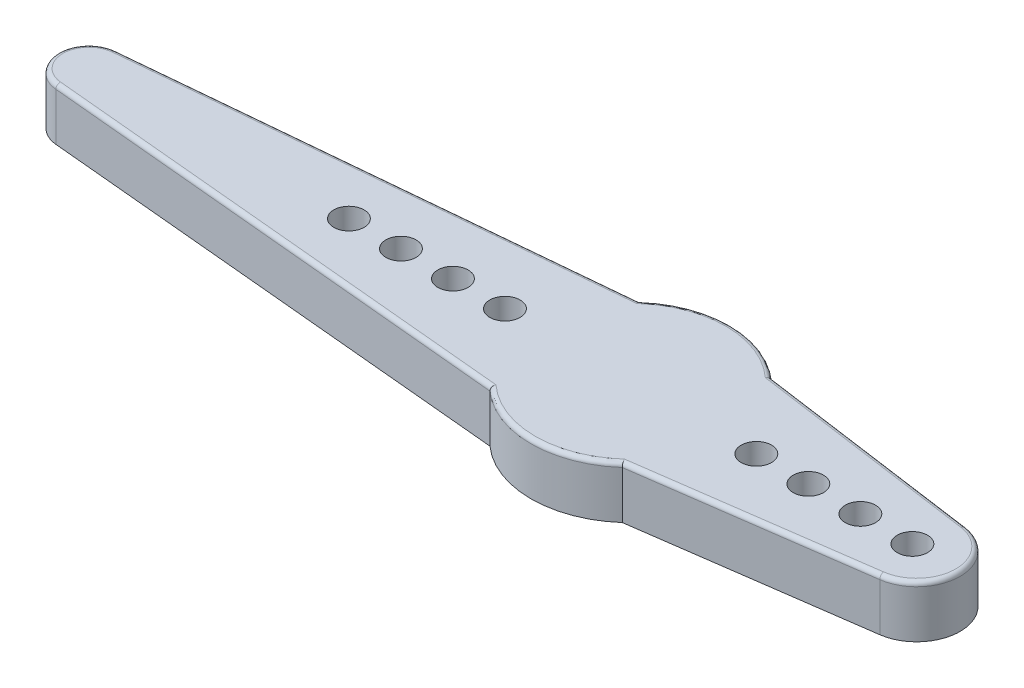
ISO-10303-21;
HEADER;
FILE_DESCRIPTION(('STEP AP214'),'2;1');
FILE_NAME('part.step','',(''),(''),'','','');
FILE_SCHEMA(('AUTOMOTIVE_DESIGN { 1 0 10303 214 1 1 1 1 }'));
ENDSEC;
DATA;
#1=APPLICATION_CONTEXT('core data for automotive mechanical design processes');
#2=APPLICATION_PROTOCOL_DEFINITION('international standard','automotive_design',2000,#1);
#3=PRODUCT_CONTEXT('',#1,'mechanical');
#4=PRODUCT('Part','Part','',(#3));
#5=PRODUCT_RELATED_PRODUCT_CATEGORY('part','',(#4));
#6=PRODUCT_DEFINITION_FORMATION('','',#4);
#7=PRODUCT_DEFINITION_CONTEXT('part definition',#1,'design');
#8=PRODUCT_DEFINITION('design','',#6,#7);
#9=PRODUCT_DEFINITION_SHAPE('','',#8);
#10=(LENGTH_UNIT() NAMED_UNIT(*) SI_UNIT(.MILLI.,.METRE.));
#11=(NAMED_UNIT(*) PLANE_ANGLE_UNIT() SI_UNIT($,.RADIAN.));
#12=(NAMED_UNIT(*) SI_UNIT($,.STERADIAN.) SOLID_ANGLE_UNIT());
#13=UNCERTAINTY_MEASURE_WITH_UNIT(LENGTH_MEASURE(1.E-05),#10,'distance_accuracy_value','');
#14=(GEOMETRIC_REPRESENTATION_CONTEXT(3) GLOBAL_UNCERTAINTY_ASSIGNED_CONTEXT((#13)) GLOBAL_UNIT_ASSIGNED_CONTEXT((#10,
#11,#12)) REPRESENTATION_CONTEXT('',''));
#15=CARTESIAN_POINT('',(0.,0.,0.));
#16=DIRECTION('',(0.,0.,1.));
#17=DIRECTION('',(1.,0.,0.));
#18=AXIS2_PLACEMENT_3D('',#15,#16,#17);
#19=CARTESIAN_POINT('',(43.4839094416453,11.7785052175783,39.0093832828117));
#20=DIRECTION('',(0.,-1.,0.));
#21=DIRECTION('',(0.,0.,-1.));
#22=AXIS2_PLACEMENT_3D('',#19,#20,#21);
#23=CYLINDRICAL_SURFACE('',#22,3.5);
#24=CARTESIAN_POINT('',(43.4839094416453,8.77850521757827,39.0093832828117));
#25=DIRECTION('',(0.,1.,0.));
#26=DIRECTION('',(0.,0.,1.));
#27=AXIS2_PLACEMENT_3D('',#24,#25,#26);
#28=CIRCLE('',#27,3.5);
#29=CARTESIAN_POINT('',(43.4839094416453,8.77850521757827,42.5093832828117));
#30=VERTEX_POINT('',#29);
#31=EDGE_CURVE('E234',#30,#30,#28,.T.);
#32=ORIENTED_EDGE('',*,*,#31,.F.);
#33=EDGE_LOOP('',(#32));
#34=FACE_BOUND('',#33,.T.);
#35=CARTESIAN_POINT('',(43.4839094416453,9.77850521757827,39.0093832828117));
#36=DIRECTION('',(0.,1.,0.));
#37=DIRECTION('',(0.,0.,1.));
#38=AXIS2_PLACEMENT_3D('',#35,#36,#37);
#39=CIRCLE('',#38,3.5);
#40=CARTESIAN_POINT('',(43.4839094416453,9.77850521757827,42.5093832828117));
#41=VERTEX_POINT('',#40);
#42=EDGE_CURVE('E172',#41,#41,#39,.F.);
#43=ORIENTED_EDGE('',*,*,#42,.F.);
#44=EDGE_LOOP('',(#43));
#45=FACE_BOUND('',#44,.T.);
#46=ADVANCED_FACE('F49',(#34,#45),#23,.F.);
#47=CARTESIAN_POINT('',(-3.6419710304706,11.7785052175783,39.2954801281411));
#48=DIRECTION('',(0.0922861612578902,0.,-0.995732526555341));
#49=DIRECTION('',(-0.995732526555341,0.,-0.0922861612578902));
#50=AXIS2_PLACEMENT_3D('',#47,#48,#49);
#51=PLANE('',#50);
#52=DIRECTION('',(0.,-1.,0.));
#53=VECTOR('',#52,1.);
#54=CARTESIAN_POINT('',(39.6665150423201,11.7785052175783,43.3093832828117));
#55=LINE('',#54,#53);
#56=CARTESIAN_POINT('',(39.6665150423201,11.5285052175783,43.3093832828117));
#57=VERTEX_POINT('',#56);
#58=CARTESIAN_POINT('',(39.6665150423201,8.77850521757827,43.3093832828117));
#59=VERTEX_POINT('',#58);
#60=EDGE_CURVE('E144',#57,#59,#55,.T.);
#61=ORIENTED_EDGE('',*,*,#60,.F.);
#62=DIRECTION('',(0.995732526555341,0.,0.0922861612578902));
#63=VECTOR('',#62,1.);
#64=CARTESIAN_POINT('',(12.072408659444,11.5285052175783,40.7519152042835));
#65=LINE('',#64,#63);
#66=CARTESIAN_POINT('',(12.072408659444,11.5285052175783,40.7519152042835));
#67=VERTEX_POINT('',#66);
#68=EDGE_CURVE('E12',#57,#67,#65,.F.);
#69=ORIENTED_EDGE('',*,*,#68,.T.);
#70=DIRECTION('',(0.,-1.,0.));
#71=VECTOR('',#70,1.);
#72=CARTESIAN_POINT('',(12.072408659444,11.7785052175783,40.7519152042835));
#73=LINE('',#72,#71);
#74=CARTESIAN_POINT('',(12.072408659444,8.77850521757827,40.7519152042835));
#75=VERTEX_POINT('',#74);
#76=EDGE_CURVE('E170',#67,#75,#73,.T.);
#77=ORIENTED_EDGE('',*,*,#76,.T.);
#78=DIRECTION('',(0.995732526555341,0.,0.0922861612578902));
#79=VECTOR('',#78,1.);
#80=CARTESIAN_POINT('',(-3.6419710304706,8.77850521757827,39.2954801281411));
#81=LINE('',#80,#79);
#82=EDGE_CURVE('E161',#75,#59,#81,.T.);
#83=ORIENTED_EDGE('',*,*,#82,.T.);
#84=EDGE_LOOP('',(#61,#69,#77,#83));
#85=FACE_BOUND('',#84,.T.);
#86=ADVANCED_FACE('F168',(#85),#51,.F.);
#87=CARTESIAN_POINT('',(43.4839094416453,11.7785052175783,39.0093832828117));
#88=DIRECTION('',(0.,-1.,0.));
#89=DIRECTION('',(0.,0.,-1.));
#90=AXIS2_PLACEMENT_3D('',#87,#88,#89);
#91=CYLINDRICAL_SURFACE('',#90,5.75);
#92=DIRECTION('',(0.,-1.,0.));
#93=VECTOR('',#92,1.);
#94=CARTESIAN_POINT('',(47.3013038409706,11.7785052175783,43.3093832828117));
#95=LINE('',#94,#93);
#96=CARTESIAN_POINT('',(47.3013038409706,11.5285052175783,43.3093832828117));
#97=VERTEX_POINT('',#96);
#98=CARTESIAN_POINT('',(47.3013038409706,8.77850521757827,43.3093832828117));
#99=VERTEX_POINT('',#98);
#100=EDGE_CURVE('E154',#97,#99,#95,.T.);
#101=ORIENTED_EDGE('',*,*,#100,.F.);
#102=CARTESIAN_POINT('',(43.4839094416453,11.5285052175783,39.0093832828117));
#103=DIRECTION('',(0.,1.,0.));
#104=DIRECTION('',(0.,0.,1.));
#105=AXIS2_PLACEMENT_3D('',#102,#103,#104);
#106=CIRCLE('',#105,5.75);
#107=EDGE_CURVE('E65',#97,#57,#106,.F.);
#108=ORIENTED_EDGE('',*,*,#107,.T.);
#109=ORIENTED_EDGE('',*,*,#60,.T.);
#110=CARTESIAN_POINT('',(43.4839094416453,8.77850521757827,39.0093832828117));
#111=DIRECTION('',(0.,1.,0.));
#112=DIRECTION('',(0.,0.,1.));
#113=AXIS2_PLACEMENT_3D('',#110,#111,#112);
#114=CIRCLE('',#113,5.75);
#115=EDGE_CURVE('E147',#59,#99,#114,.T.);
#116=ORIENTED_EDGE('',*,*,#115,.T.);
#117=EDGE_LOOP('',(#101,#108,#109,#116));
#118=FACE_BOUND('',#117,.T.);
#119=ADVANCED_FACE('F146',(#118),#91,.T.);
#120=CARTESIAN_POINT('',(6.85626332111162,11.7785052175783,48.9718569028592));
#121=DIRECTION('',(-0.138651877853248,0.,-0.990341182001318));
#122=DIRECTION('',(-0.990341182001318,0.,0.138651877853248));
#123=AXIS2_PLACEMENT_3D('',#120,#121,#122);
#124=PLANE('',#123);
#125=DIRECTION('',(0.,-1.,0.));
#126=VECTOR('',#125,1.);
#127=CARTESIAN_POINT('',(60.3305391362785,11.7785052175783,41.485236237815));
#128=LINE('',#127,#126);
#129=CARTESIAN_POINT('',(60.3305391362785,11.5285052175783,41.485236237815));
#130=VERTEX_POINT('',#129);
#131=CARTESIAN_POINT('',(60.3305391362785,8.77850521757827,41.485236237815));
#132=VERTEX_POINT('',#131);
#133=EDGE_CURVE('E253',#130,#132,#128,.T.);
#134=ORIENTED_EDGE('',*,*,#133,.F.);
#135=DIRECTION('',(0.990341182001318,0.,-0.138651877853248));
#136=VECTOR('',#135,1.);
#137=CARTESIAN_POINT('',(47.3013038409706,11.5285052175783,43.3093832828117));
#138=LINE('',#137,#136);
#139=EDGE_CURVE('E80',#130,#97,#138,.F.);
#140=ORIENTED_EDGE('',*,*,#139,.T.);
#141=ORIENTED_EDGE('',*,*,#100,.T.);
#142=DIRECTION('',(0.990341182001318,0.,-0.138651877853248));
#143=VECTOR('',#142,1.);
#144=CARTESIAN_POINT('',(6.85626332111162,8.77850521757827,48.9718569028592));
#145=LINE('',#144,#143);
#146=EDGE_CURVE('E165',#99,#132,#145,.T.);
#147=ORIENTED_EDGE('',*,*,#146,.T.);
#148=EDGE_LOOP('',(#134,#140,#141,#147));
#149=FACE_BOUND('',#148,.T.);
#150=ADVANCED_FACE('F432',(#149),#124,.F.);
#151=CARTESIAN_POINT('',(59.9839094416453,11.7785052175783,39.0093832828117));
#152=DIRECTION('',(0.,-1.,0.));
#153=DIRECTION('',(0.,0.,-1.));
#154=AXIS2_PLACEMENT_3D('',#151,#152,#153);
#155=CYLINDRICAL_SURFACE('',#154,2.5);
#156=DIRECTION('',(0.,-1.,0.));
#157=VECTOR('',#156,1.);
#158=CARTESIAN_POINT('',(60.3305391362785,11.7785052175783,36.5335303278084));
#159=LINE('',#158,#157);
#160=CARTESIAN_POINT('',(60.3305391362785,11.5285052175783,36.5335303278084));
#161=VERTEX_POINT('',#160);
#162=CARTESIAN_POINT('',(60.3305391362785,8.77850521757827,36.5335303278084));
#163=VERTEX_POINT('',#162);
#164=EDGE_CURVE('E250',#161,#163,#159,.T.);
#165=ORIENTED_EDGE('',*,*,#164,.F.);
#166=CARTESIAN_POINT('',(59.9839094416453,11.5285052175783,39.0093832828117));
#167=DIRECTION('',(0.,1.,0.));
#168=DIRECTION('',(0.,0.,1.));
#169=AXIS2_PLACEMENT_3D('',#166,#167,#168);
#170=CIRCLE('',#169,2.5);
#171=EDGE_CURVE('E286',#161,#130,#170,.F.);
#172=ORIENTED_EDGE('',*,*,#171,.T.);
#173=ORIENTED_EDGE('',*,*,#133,.T.);
#174=CARTESIAN_POINT('',(59.9839094416453,8.77850521757827,39.0093832828117));
#175=DIRECTION('',(0.,1.,0.));
#176=DIRECTION('',(0.,0.,1.));
#177=AXIS2_PLACEMENT_3D('',#174,#175,#176);
#178=CIRCLE('',#177,2.5);
#179=EDGE_CURVE('E183',#132,#163,#178,.T.);
#180=ORIENTED_EDGE('',*,*,#179,.T.);
#181=EDGE_LOOP('',(#165,#172,#173,#180));
#182=FACE_BOUND('',#181,.T.);
#183=ADVANCED_FACE('F428',(#182),#155,.T.);
#184=CARTESIAN_POINT('',(-3.85670140481076,11.7785052175783,27.5470501157512));
#185=DIRECTION('',(-0.138651877853248,0.,0.990341182001318));
#186=DIRECTION('',(0.990341182001318,0.,0.138651877853248));
#187=AXIS2_PLACEMENT_3D('',#184,#185,#186);
#188=PLANE('',#187);
#189=DIRECTION('',(0.,-1.,0.));
#190=VECTOR('',#189,1.);
#191=CARTESIAN_POINT('',(47.3013038409706,11.7785052175783,34.7093832828117));
#192=LINE('',#191,#190);
#193=CARTESIAN_POINT('',(47.3013038409706,11.5285052175783,34.7093832828117));
#194=VERTEX_POINT('',#193);
#195=CARTESIAN_POINT('',(47.3013038409706,8.77850521757827,34.7093832828117));
#196=VERTEX_POINT('',#195);
#197=EDGE_CURVE('E247',#194,#196,#192,.T.);
#198=ORIENTED_EDGE('',*,*,#197,.F.);
#199=DIRECTION('',(-0.990341182001318,0.,-0.138651877853248));
#200=VECTOR('',#199,1.);
#201=CARTESIAN_POINT('',(60.3305391362785,11.5285052175783,36.5335303278084));
#202=LINE('',#201,#200);
#203=EDGE_CURVE('E282',#194,#161,#202,.F.);
#204=ORIENTED_EDGE('',*,*,#203,.T.);
#205=ORIENTED_EDGE('',*,*,#164,.T.);
#206=DIRECTION('',(-0.990341182001318,0.,-0.138651877853248));
#207=VECTOR('',#206,1.);
#208=CARTESIAN_POINT('',(-3.85670140481076,8.77850521757827,27.5470501157512));
#209=LINE('',#208,#207);
#210=EDGE_CURVE('E187',#163,#196,#209,.T.);
#211=ORIENTED_EDGE('',*,*,#210,.T.);
#212=EDGE_LOOP('',(#198,#204,#205,#211));
#213=FACE_BOUND('',#212,.T.);
#214=ADVANCED_FACE('F424',(#213),#188,.F.);
#215=CARTESIAN_POINT('',(43.4839094416453,11.7785052175783,39.0093832828117));
#216=DIRECTION('',(0.,-1.,0.));
#217=DIRECTION('',(0.,0.,-1.));
#218=AXIS2_PLACEMENT_3D('',#215,#216,#217);
#219=CYLINDRICAL_SURFACE('',#218,5.75);
#220=DIRECTION('',(0.,-1.,0.));
#221=VECTOR('',#220,1.);
#222=CARTESIAN_POINT('',(39.6665150423201,11.7785052175783,34.7093832828117));
#223=LINE('',#222,#221);
#224=CARTESIAN_POINT('',(39.6665150423201,11.5285052175783,34.7093832828117));
#225=VERTEX_POINT('',#224);
#226=CARTESIAN_POINT('',(39.6665150423201,8.77850521757827,34.7093832828117));
#227=VERTEX_POINT('',#226);
#228=EDGE_CURVE('E244',#225,#227,#223,.T.);
#229=ORIENTED_EDGE('',*,*,#228,.F.);
#230=CARTESIAN_POINT('',(43.4839094416453,11.5285052175783,39.0093832828117));
#231=DIRECTION('',(0.,1.,0.));
#232=DIRECTION('',(0.,0.,1.));
#233=AXIS2_PLACEMENT_3D('',#230,#231,#232);
#234=CIRCLE('',#233,5.75);
#235=EDGE_CURVE('E295',#225,#194,#234,.F.);
#236=ORIENTED_EDGE('',*,*,#235,.T.);
#237=ORIENTED_EDGE('',*,*,#197,.T.);
#238=CARTESIAN_POINT('',(43.4839094416453,8.77850521757827,39.0093832828117));
#239=DIRECTION('',(0.,1.,0.));
#240=DIRECTION('',(0.,0.,1.));
#241=AXIS2_PLACEMENT_3D('',#238,#239,#240);
#242=CIRCLE('',#241,5.75);
#243=EDGE_CURVE('E191',#196,#227,#242,.T.);
#244=ORIENTED_EDGE('',*,*,#243,.T.);
#245=EDGE_LOOP('',(#229,#236,#237,#244));
#246=FACE_BOUND('',#245,.T.);
#247=ADVANCED_FACE('F420',(#246),#219,.T.);
#248=CARTESIAN_POINT('',(3.52735540922003,11.7785052175783,38.0588212339476));
#249=DIRECTION('',(-0.0922861612578902,0.,-0.995732526555341));
#250=DIRECTION('',(-0.995732526555341,0.,0.0922861612578902));
#251=AXIS2_PLACEMENT_3D('',#248,#249,#250);
#252=PLANE('',#251);
#253=DIRECTION('',(0.,-1.,0.));
#254=VECTOR('',#253,1.);
#255=CARTESIAN_POINT('',(12.072408659444,11.7785052175783,37.2668513613399));
#256=LINE('',#255,#254);
#257=CARTESIAN_POINT('',(12.072408659444,11.5285052175783,37.2668513613399));
#258=VERTEX_POINT('',#257);
#259=CARTESIAN_POINT('',(12.072408659444,8.77850521757827,37.2668513613399));
#260=VERTEX_POINT('',#259);
#261=EDGE_CURVE('E241',#258,#260,#256,.T.);
#262=ORIENTED_EDGE('',*,*,#261,.F.);
#263=DIRECTION('',(0.995732526555341,0.,-0.0922861612578902));
#264=VECTOR('',#263,1.);
#265=CARTESIAN_POINT('',(3.52735540922003,11.5285052175783,38.0588212339476));
#266=LINE('',#265,#264);
#267=EDGE_CURVE('E289',#258,#225,#266,.T.);
#268=ORIENTED_EDGE('',*,*,#267,.T.);
#269=ORIENTED_EDGE('',*,*,#228,.T.);
#270=DIRECTION('',(0.995732526555341,0.,-0.0922861612578902));
#271=VECTOR('',#270,1.);
#272=CARTESIAN_POINT('',(3.52735540922003,8.77850521757827,38.0588212339476));
#273=LINE('',#272,#271);
#274=EDGE_CURVE('E195',#260,#227,#273,.T.);
#275=ORIENTED_EDGE('',*,*,#274,.F.);
#276=EDGE_LOOP('',(#262,#268,#269,#275));
#277=FACE_BOUND('',#276,.T.);
#278=ADVANCED_FACE('F384',(#277),#252,.T.);
#279=CARTESIAN_POINT('',(27.2339094416453,11.7785052175783,39.0093832828117));
#280=DIRECTION('',(0.,-1.,0.));
#281=DIRECTION('',(0.,0.,-1.));
#282=AXIS2_PLACEMENT_3D('',#279,#280,#281);
#283=CYLINDRICAL_SURFACE('',#282,0.875000000000002);
#284=CARTESIAN_POINT('',(27.2339094416453,11.7785052175783,39.0093832828117));
#285=DIRECTION('',(0.,1.,0.));
#286=DIRECTION('',(0.,0.,1.));
#287=AXIS2_PLACEMENT_3D('',#284,#285,#286);
#288=CIRCLE('',#287,0.875000000000002);
#289=CARTESIAN_POINT('',(27.2339094416453,11.7785052175783,39.8843832828117));
#290=VERTEX_POINT('',#289);
#291=EDGE_CURVE('E178',#290,#290,#288,.T.);
#292=ORIENTED_EDGE('',*,*,#291,.T.);
#293=EDGE_LOOP('',(#292));
#294=FACE_BOUND('',#293,.T.);
#295=CARTESIAN_POINT('',(27.2339094416453,8.77850521757827,39.0093832828117));
#296=DIRECTION('',(0.,1.,0.));
#297=DIRECTION('',(0.,0.,1.));
#298=AXIS2_PLACEMENT_3D('',#295,#296,#297);
#299=CIRCLE('',#298,0.875000000000002);
#300=CARTESIAN_POINT('',(27.2339094416453,8.77850521757827,39.8843832828117));
#301=VERTEX_POINT('',#300);
#302=EDGE_CURVE('E230',#301,#301,#299,.T.);
#303=ORIENTED_EDGE('',*,*,#302,.F.);
#304=EDGE_LOOP('',(#303));
#305=FACE_BOUND('',#304,.T.);
#306=ADVANCED_FACE('F380',(#294,#305),#283,.F.);
#307=CARTESIAN_POINT('',(30.2339094416453,11.7785052175783,39.0093832828117));
#308=DIRECTION('',(0.,-1.,0.));
#309=DIRECTION('',(0.,0.,-1.));
#310=AXIS2_PLACEMENT_3D('',#307,#308,#309);
#311=CYLINDRICAL_SURFACE('',#310,0.875000000000002);
#312=CARTESIAN_POINT('',(30.2339094416453,11.7785052175783,39.0093832828117));
#313=DIRECTION('',(0.,1.,0.));
#314=DIRECTION('',(0.,0.,1.));
#315=AXIS2_PLACEMENT_3D('',#312,#313,#314);
#316=CIRCLE('',#315,0.875000000000002);
#317=CARTESIAN_POINT('',(30.2339094416453,11.7785052175783,39.8843832828117));
#318=VERTEX_POINT('',#317);
#319=EDGE_CURVE('E597',#318,#318,#316,.T.);
#320=ORIENTED_EDGE('',*,*,#319,.T.);
#321=EDGE_LOOP('',(#320));
#322=FACE_BOUND('',#321,.T.);
#323=CARTESIAN_POINT('',(30.2339094416453,8.77850521757827,39.0093832828117));
#324=DIRECTION('',(0.,1.,0.));
#325=DIRECTION('',(0.,0.,1.));
#326=AXIS2_PLACEMENT_3D('',#323,#324,#325);
#327=CIRCLE('',#326,0.875000000000002);
#328=CARTESIAN_POINT('',(30.2339094416453,8.77850521757827,39.8843832828117));
#329=VERTEX_POINT('',#328);
#330=EDGE_CURVE('E226',#329,#329,#327,.T.);
#331=ORIENTED_EDGE('',*,*,#330,.F.);
#332=EDGE_LOOP('',(#331));
#333=FACE_BOUND('',#332,.T.);
#334=ADVANCED_FACE('F383',(#322,#333),#311,.F.);
#335=CARTESIAN_POINT('',(33.2339094416453,11.7785052175783,39.0093832828117));
#336=DIRECTION('',(0.,-1.,0.));
#337=DIRECTION('',(0.,0.,-1.));
#338=AXIS2_PLACEMENT_3D('',#335,#336,#337);
#339=CYLINDRICAL_SURFACE('',#338,0.874999999999998);
#340=CARTESIAN_POINT('',(33.2339094416453,11.7785052175783,39.0093832828117));
#341=DIRECTION('',(0.,1.,0.));
#342=DIRECTION('',(0.,0.,1.));
#343=AXIS2_PLACEMENT_3D('',#340,#341,#342);
#344=CIRCLE('',#343,0.874999999999998);
#345=CARTESIAN_POINT('',(33.2339094416453,11.7785052175783,39.8843832828117));
#346=VERTEX_POINT('',#345);
#347=EDGE_CURVE('E593',#346,#346,#344,.T.);
#348=ORIENTED_EDGE('',*,*,#347,.T.);
#349=EDGE_LOOP('',(#348));
#350=FACE_BOUND('',#349,.T.);
#351=CARTESIAN_POINT('',(33.2339094416453,8.77850521757827,39.0093832828117));
#352=DIRECTION('',(0.,1.,0.));
#353=DIRECTION('',(0.,0.,1.));
#354=AXIS2_PLACEMENT_3D('',#351,#352,#353);
#355=CIRCLE('',#354,0.874999999999998);
#356=CARTESIAN_POINT('',(33.2339094416453,8.77850521757827,39.8843832828117));
#357=VERTEX_POINT('',#356);
#358=EDGE_CURVE('E222',#357,#357,#355,.T.);
#359=ORIENTED_EDGE('',*,*,#358,.F.);
#360=EDGE_LOOP('',(#359));
#361=FACE_BOUND('',#360,.T.);
#362=ADVANCED_FACE('F388',(#350,#361),#339,.F.);
#363=CARTESIAN_POINT('',(36.2339094416453,11.7785052175783,39.0093832828117));
#364=DIRECTION('',(0.,-1.,0.));
#365=DIRECTION('',(0.,0.,-1.));
#366=AXIS2_PLACEMENT_3D('',#363,#364,#365);
#367=CYLINDRICAL_SURFACE('',#366,0.874999999999998);
#368=CARTESIAN_POINT('',(36.2339094416453,11.7785052175783,39.0093832828117));
#369=DIRECTION('',(0.,1.,0.));
#370=DIRECTION('',(0.,0.,1.));
#371=AXIS2_PLACEMENT_3D('',#368,#369,#370);
#372=CIRCLE('',#371,0.874999999999998);
#373=CARTESIAN_POINT('',(36.2339094416453,11.7785052175783,39.8843832828117));
#374=VERTEX_POINT('',#373);
#375=EDGE_CURVE('E589',#374,#374,#372,.T.);
#376=ORIENTED_EDGE('',*,*,#375,.T.);
#377=EDGE_LOOP('',(#376));
#378=FACE_BOUND('',#377,.T.);
#379=CARTESIAN_POINT('',(36.2339094416453,8.77850521757827,39.0093832828117));
#380=DIRECTION('',(0.,1.,0.));
#381=DIRECTION('',(0.,0.,1.));
#382=AXIS2_PLACEMENT_3D('',#379,#380,#381);
#383=CIRCLE('',#382,0.874999999999998);
#384=CARTESIAN_POINT('',(36.2339094416453,8.77850521757827,39.8843832828117));
#385=VERTEX_POINT('',#384);
#386=EDGE_CURVE('E218',#385,#385,#383,.T.);
#387=ORIENTED_EDGE('',*,*,#386,.F.);
#388=EDGE_LOOP('',(#387));
#389=FACE_BOUND('',#388,.T.);
#390=ADVANCED_FACE('F392',(#378,#389),#367,.F.);
#391=CARTESIAN_POINT('',(50.7339094416453,11.7785052175783,39.0093832828117));
#392=DIRECTION('',(0.,-1.,0.));
#393=DIRECTION('',(0.,0.,-1.));
#394=AXIS2_PLACEMENT_3D('',#391,#392,#393);
#395=CYLINDRICAL_SURFACE('',#394,0.874999999999998);
#396=CARTESIAN_POINT('',(50.7339094416453,11.7785052175783,39.0093832828117));
#397=DIRECTION('',(0.,1.,0.));
#398=DIRECTION('',(0.,0.,1.));
#399=AXIS2_PLACEMENT_3D('',#396,#397,#398);
#400=CIRCLE('',#399,0.874999999999998);
#401=CARTESIAN_POINT('',(50.7339094416453,11.7785052175783,39.8843832828117));
#402=VERTEX_POINT('',#401);
#403=EDGE_CURVE('E585',#402,#402,#400,.T.);
#404=ORIENTED_EDGE('',*,*,#403,.T.);
#405=EDGE_LOOP('',(#404));
#406=FACE_BOUND('',#405,.T.);
#407=CARTESIAN_POINT('',(50.7339094416453,8.77850521757827,39.0093832828117));
#408=DIRECTION('',(0.,1.,0.));
#409=DIRECTION('',(0.,0.,1.));
#410=AXIS2_PLACEMENT_3D('',#407,#408,#409);
#411=CIRCLE('',#410,0.874999999999998);
#412=CARTESIAN_POINT('',(50.7339094416453,8.77850521757827,39.8843832828117));
#413=VERTEX_POINT('',#412);
#414=EDGE_CURVE('E214',#413,#413,#411,.T.);
#415=ORIENTED_EDGE('',*,*,#414,.F.);
#416=EDGE_LOOP('',(#415));
#417=FACE_BOUND('',#416,.T.);
#418=ADVANCED_FACE('F396',(#406,#417),#395,.F.);
#419=CARTESIAN_POINT('',(53.7339094416453,11.7785052175783,39.0093832828117));
#420=DIRECTION('',(0.,-1.,0.));
#421=DIRECTION('',(0.,0.,-1.));
#422=AXIS2_PLACEMENT_3D('',#419,#420,#421);
#423=CYLINDRICAL_SURFACE('',#422,0.874999999999998);
#424=CARTESIAN_POINT('',(53.7339094416453,11.7785052175783,39.0093832828117));
#425=DIRECTION('',(0.,1.,0.));
#426=DIRECTION('',(0.,0.,1.));
#427=AXIS2_PLACEMENT_3D('',#424,#425,#426);
#428=CIRCLE('',#427,0.874999999999998);
#429=CARTESIAN_POINT('',(53.7339094416453,11.7785052175783,39.8843832828117));
#430=VERTEX_POINT('',#429);
#431=EDGE_CURVE('E581',#430,#430,#428,.T.);
#432=ORIENTED_EDGE('',*,*,#431,.T.);
#433=EDGE_LOOP('',(#432));
#434=FACE_BOUND('',#433,.T.);
#435=CARTESIAN_POINT('',(53.7339094416453,8.77850521757827,39.0093832828117));
#436=DIRECTION('',(0.,1.,0.));
#437=DIRECTION('',(0.,0.,1.));
#438=AXIS2_PLACEMENT_3D('',#435,#436,#437);
#439=CIRCLE('',#438,0.874999999999998);
#440=CARTESIAN_POINT('',(53.7339094416453,8.77850521757827,39.8843832828117));
#441=VERTEX_POINT('',#440);
#442=EDGE_CURVE('E210',#441,#441,#439,.T.);
#443=ORIENTED_EDGE('',*,*,#442,.F.);
#444=EDGE_LOOP('',(#443));
#445=FACE_BOUND('',#444,.T.);
#446=ADVANCED_FACE('F400',(#434,#445),#423,.F.);
#447=CARTESIAN_POINT('',(56.7339094416453,11.7785052175783,39.0093832828117));
#448=DIRECTION('',(0.,-1.,0.));
#449=DIRECTION('',(0.,0.,-1.));
#450=AXIS2_PLACEMENT_3D('',#447,#448,#449);
#451=CYLINDRICAL_SURFACE('',#450,0.874999999999998);
#452=CARTESIAN_POINT('',(56.7339094416453,11.7785052175783,39.0093832828117));
#453=DIRECTION('',(0.,1.,0.));
#454=DIRECTION('',(0.,0.,1.));
#455=AXIS2_PLACEMENT_3D('',#452,#453,#454);
#456=CIRCLE('',#455,0.874999999999998);
#457=CARTESIAN_POINT('',(56.7339094416453,11.7785052175783,39.8843832828117));
#458=VERTEX_POINT('',#457);
#459=EDGE_CURVE('E577',#458,#458,#456,.T.);
#460=ORIENTED_EDGE('',*,*,#459,.T.);
#461=EDGE_LOOP('',(#460));
#462=FACE_BOUND('',#461,.T.);
#463=CARTESIAN_POINT('',(56.7339094416453,8.77850521757827,39.0093832828117));
#464=DIRECTION('',(0.,1.,0.));
#465=DIRECTION('',(0.,0.,1.));
#466=AXIS2_PLACEMENT_3D('',#463,#464,#465);
#467=CIRCLE('',#466,0.874999999999998);
#468=CARTESIAN_POINT('',(56.7339094416453,8.77850521757827,39.8843832828117));
#469=VERTEX_POINT('',#468);
#470=EDGE_CURVE('E206',#469,#469,#467,.T.);
#471=ORIENTED_EDGE('',*,*,#470,.F.);
#472=EDGE_LOOP('',(#471));
#473=FACE_BOUND('',#472,.T.);
#474=ADVANCED_FACE('F404',(#462,#473),#451,.F.);
#475=CARTESIAN_POINT('',(59.7339094416453,11.7785052175783,39.0093832828117));
#476=DIRECTION('',(0.,-1.,0.));
#477=DIRECTION('',(0.,0.,-1.));
#478=AXIS2_PLACEMENT_3D('',#475,#476,#477);
#479=CYLINDRICAL_SURFACE('',#478,0.874999999999998);
#480=CARTESIAN_POINT('',(59.7339094416453,11.7785052175783,39.0093832828117));
#481=DIRECTION('',(0.,1.,0.));
#482=DIRECTION('',(0.,0.,1.));
#483=AXIS2_PLACEMENT_3D('',#480,#481,#482);
#484=CIRCLE('',#483,0.874999999999998);
#485=CARTESIAN_POINT('',(59.7339094416453,11.7785052175783,39.8843832828117));
#486=VERTEX_POINT('',#485);
#487=EDGE_CURVE('E238',#486,#486,#484,.T.);
#488=ORIENTED_EDGE('',*,*,#487,.T.);
#489=EDGE_LOOP('',(#488));
#490=FACE_BOUND('',#489,.T.);
#491=CARTESIAN_POINT('',(59.7339094416453,8.77850521757827,39.0093832828117));
#492=DIRECTION('',(0.,1.,0.));
#493=DIRECTION('',(0.,0.,1.));
#494=AXIS2_PLACEMENT_3D('',#491,#492,#493);
#495=CIRCLE('',#494,0.874999999999998);
#496=CARTESIAN_POINT('',(59.7339094416453,8.77850521757827,39.8843832828117));
#497=VERTEX_POINT('',#496);
#498=EDGE_CURVE('E202',#497,#497,#495,.T.);
#499=ORIENTED_EDGE('',*,*,#498,.F.);
#500=EDGE_LOOP('',(#499));
#501=FACE_BOUND('',#500,.T.);
#502=ADVANCED_FACE('F408',(#490,#501),#479,.F.);
#503=CARTESIAN_POINT('',(12.2339094416453,11.7785052175783,39.0093832828117));
#504=DIRECTION('',(0.,-1.,0.));
#505=DIRECTION('',(0.,0.,-1.));
#506=AXIS2_PLACEMENT_3D('',#503,#504,#505);
#507=CYLINDRICAL_SURFACE('',#506,1.75);
#508=ORIENTED_EDGE('',*,*,#76,.F.);
#509=CARTESIAN_POINT('',(12.2339094416453,11.5285052175783,39.0093832828117));
#510=DIRECTION('',(0.,1.,0.));
#511=DIRECTION('',(0.,0.,1.));
#512=AXIS2_PLACEMENT_3D('',#509,#510,#511);
#513=CIRCLE('',#512,1.75);
#514=EDGE_CURVE('E292',#67,#258,#513,.F.);
#515=ORIENTED_EDGE('',*,*,#514,.T.);
#516=ORIENTED_EDGE('',*,*,#261,.T.);
#517=CARTESIAN_POINT('',(12.2339094416453,8.77850521757827,39.0093832828117));
#518=DIRECTION('',(0.,1.,0.));
#519=DIRECTION('',(0.,0.,1.));
#520=AXIS2_PLACEMENT_3D('',#517,#518,#519);
#521=CIRCLE('',#520,1.75);
#522=EDGE_CURVE('E199',#75,#260,#521,.F.);
#523=ORIENTED_EDGE('',*,*,#522,.F.);
#524=EDGE_LOOP('',(#508,#515,#516,#523));
#525=FACE_BOUND('',#524,.T.);
#526=ADVANCED_FACE('F412',(#525),#507,.T.);
#527=CARTESIAN_POINT('',(0.,11.7785052175783,0.));
#528=DIRECTION('',(0.,1.,0.));
#529=DIRECTION('',(0.,0.,1.));
#530=AXIS2_PLACEMENT_3D('',#527,#528,#529);
#531=PLANE('',#530);
#532=DIRECTION('',(-0.990341182001318,0.,-0.138651877853248));
#533=VECTOR('',#532,1.);
#534=CARTESIAN_POINT('',(47.2666408715073,11.7785052175783,34.956968578312));
#535=LINE('',#534,#533);
#536=CARTESIAN_POINT('',(60.2958761668151,11.7785052175783,36.7811156233087));
#537=VERTEX_POINT('',#536);
#538=CARTESIAN_POINT('',(47.1909158867601,11.7785052175783,34.9463667660008));
#539=VERTEX_POINT('',#538);
#540=EDGE_CURVE('E275',#537,#539,#535,.T.);
#541=ORIENTED_EDGE('',*,*,#540,.T.);
#542=CARTESIAN_POINT('',(43.4839094416453,11.7785052175783,39.0093832828117));
#543=DIRECTION('',(0.,1.,0.));
#544=DIRECTION('',(0.,0.,1.));
#545=AXIS2_PLACEMENT_3D('',#542,#543,#544);
#546=CIRCLE('',#545,5.5);
#547=CARTESIAN_POINT('',(39.7722036561621,11.7785052175783,34.9506593254564));
#548=VERTEX_POINT('',#547);
#549=EDGE_CURVE('E279',#539,#548,#546,.T.);
#550=ORIENTED_EDGE('',*,*,#549,.T.);
#551=DIRECTION('',(0.995732526555341,0.,-0.0922861612578902));
#552=VECTOR('',#551,1.);
#553=CARTESIAN_POINT('',(3.5504269495345,11.7785052175783,38.3077543655865));
#554=LINE('',#553,#552);
#555=CARTESIAN_POINT('',(12.0954801997585,11.7785052175783,37.5157844929787));
#556=VERTEX_POINT('',#555);
#557=EDGE_CURVE('E269',#548,#556,#554,.F.);
#558=ORIENTED_EDGE('',*,*,#557,.T.);
#559=CARTESIAN_POINT('',(12.2339094416453,11.7785052175783,39.0093832828117));
#560=DIRECTION('',(0.,1.,0.));
#561=DIRECTION('',(0.,0.,1.));
#562=AXIS2_PLACEMENT_3D('',#559,#560,#561);
#563=CIRCLE('',#562,1.5);
#564=CARTESIAN_POINT('',(12.0954801997585,11.7785052175783,40.5029820726447));
#565=VERTEX_POINT('',#564);
#566=EDGE_CURVE('E266',#556,#565,#563,.T.);
#567=ORIENTED_EDGE('',*,*,#566,.T.);
#568=DIRECTION('',(0.995732526555341,0.,0.0922861612578902));
#569=VECTOR('',#568,1.);
#570=CARTESIAN_POINT('',(39.6895865826345,11.7785052175783,43.0604501511729));
#571=LINE('',#570,#569);
#572=CARTESIAN_POINT('',(39.7722036561621,11.7785052175783,43.068107240167));
#573=VERTEX_POINT('',#572);
#574=EDGE_CURVE('E153',#565,#573,#571,.T.);
#575=ORIENTED_EDGE('',*,*,#574,.T.);
#576=CARTESIAN_POINT('',(43.4839094416453,11.7785052175783,39.0093832828117));
#577=DIRECTION('',(0.,1.,0.));
#578=DIRECTION('',(0.,0.,1.));
#579=AXIS2_PLACEMENT_3D('',#576,#577,#578);
#580=CIRCLE('',#579,5.5);
#581=CARTESIAN_POINT('',(47.1909158867601,11.7785052175783,43.0723997996225));
#582=VERTEX_POINT('',#581);
#583=EDGE_CURVE('E260',#573,#582,#580,.T.);
#584=ORIENTED_EDGE('',*,*,#583,.T.);
#585=DIRECTION('',(0.990341182001318,0.,-0.138651877853248));
#586=VECTOR('',#585,1.);
#587=CARTESIAN_POINT('',(60.2958761668152,11.7785052175783,41.2376509423146));
#588=LINE('',#587,#586);
#589=CARTESIAN_POINT('',(60.2958761668151,11.7785052175783,41.2376509423146));
#590=VERTEX_POINT('',#589);
#591=EDGE_CURVE('E263',#582,#590,#588,.T.);
#592=ORIENTED_EDGE('',*,*,#591,.T.);
#593=CARTESIAN_POINT('',(59.9839094416453,11.7785052175783,39.0093832828117));
#594=DIRECTION('',(0.,1.,0.));
#595=DIRECTION('',(0.,0.,1.));
#596=AXIS2_PLACEMENT_3D('',#593,#594,#595);
#597=CIRCLE('',#596,2.25);
#598=EDGE_CURVE('E272',#590,#537,#597,.T.);
#599=ORIENTED_EDGE('',*,*,#598,.T.);
#600=EDGE_LOOP('',(#541,#550,#558,#567,#575,#584,#592,#599));
#601=FACE_BOUND('',#600,.T.);
#602=ORIENTED_EDGE('',*,*,#487,.F.);
#603=EDGE_LOOP('',(#602));
#604=FACE_BOUND('',#603,.T.);
#605=ORIENTED_EDGE('',*,*,#459,.F.);
#606=EDGE_LOOP('',(#605));
#607=FACE_BOUND('',#606,.T.);
#608=ORIENTED_EDGE('',*,*,#431,.F.);
#609=EDGE_LOOP('',(#608));
#610=FACE_BOUND('',#609,.T.);
#611=ORIENTED_EDGE('',*,*,#403,.F.);
#612=EDGE_LOOP('',(#611));
#613=FACE_BOUND('',#612,.T.);
#614=ORIENTED_EDGE('',*,*,#375,.F.);
#615=EDGE_LOOP('',(#614));
#616=FACE_BOUND('',#615,.T.);
#617=ORIENTED_EDGE('',*,*,#347,.F.);
#618=EDGE_LOOP('',(#617));
#619=FACE_BOUND('',#618,.T.);
#620=ORIENTED_EDGE('',*,*,#319,.F.);
#621=EDGE_LOOP('',(#620));
#622=FACE_BOUND('',#621,.T.);
#623=ORIENTED_EDGE('',*,*,#291,.F.);
#624=EDGE_LOOP('',(#623));
#625=FACE_BOUND('',#624,.T.);
#626=ADVANCED_FACE('F416',(#601,#604,#607,#610,#613,#616,#619,#622,#625),#531,.T.);
#627=CARTESIAN_POINT('',(0.,8.77850521757827,0.));
#628=DIRECTION('',(0.,1.,0.));
#629=DIRECTION('',(0.,0.,1.));
#630=AXIS2_PLACEMENT_3D('',#627,#628,#629);
#631=PLANE('',#630);
#632=ORIENTED_EDGE('',*,*,#82,.F.);
#633=ORIENTED_EDGE('',*,*,#522,.T.);
#634=ORIENTED_EDGE('',*,*,#274,.T.);
#635=ORIENTED_EDGE('',*,*,#243,.F.);
#636=ORIENTED_EDGE('',*,*,#210,.F.);
#637=ORIENTED_EDGE('',*,*,#179,.F.);
#638=ORIENTED_EDGE('',*,*,#146,.F.);
#639=ORIENTED_EDGE('',*,*,#115,.F.);
#640=EDGE_LOOP('',(#632,#633,#634,#635,#636,#637,#638,#639));
#641=FACE_BOUND('',#640,.T.);
#642=ORIENTED_EDGE('',*,*,#498,.T.);
#643=EDGE_LOOP('',(#642));
#644=FACE_BOUND('',#643,.T.);
#645=ORIENTED_EDGE('',*,*,#470,.T.);
#646=EDGE_LOOP('',(#645));
#647=FACE_BOUND('',#646,.T.);
#648=ORIENTED_EDGE('',*,*,#442,.T.);
#649=EDGE_LOOP('',(#648));
#650=FACE_BOUND('',#649,.T.);
#651=ORIENTED_EDGE('',*,*,#414,.T.);
#652=EDGE_LOOP('',(#651));
#653=FACE_BOUND('',#652,.T.);
#654=ORIENTED_EDGE('',*,*,#386,.T.);
#655=EDGE_LOOP('',(#654));
#656=FACE_BOUND('',#655,.T.);
#657=ORIENTED_EDGE('',*,*,#358,.T.);
#658=EDGE_LOOP('',(#657));
#659=FACE_BOUND('',#658,.T.);
#660=ORIENTED_EDGE('',*,*,#330,.T.);
#661=EDGE_LOOP('',(#660));
#662=FACE_BOUND('',#661,.T.);
#663=ORIENTED_EDGE('',*,*,#302,.T.);
#664=EDGE_LOOP('',(#663));
#665=FACE_BOUND('',#664,.T.);
#666=ORIENTED_EDGE('',*,*,#31,.T.);
#667=EDGE_LOOP('',(#666));
#668=FACE_BOUND('',#667,.T.);
#669=ADVANCED_FACE('F158',(#641,#644,#647,#650,#653,#656,#659,#662,#665,#668),#631,.F.);
#670=CARTESIAN_POINT('',(0.,9.77850521757827,0.));
#671=DIRECTION('',(0.,1.,0.));
#672=DIRECTION('',(0.,0.,1.));
#673=AXIS2_PLACEMENT_3D('',#670,#671,#672);
#674=PLANE('',#673);
#675=ORIENTED_EDGE('',*,*,#42,.T.);
#676=EDGE_LOOP('',(#675));
#677=FACE_BOUND('',#676,.T.);
#678=ADVANCED_FACE('F489',(#677),#674,.F.);
#679=CARTESIAN_POINT('',(-3.61889949015612,11.5285052175783,39.0465469965022));
#680=DIRECTION('',(-0.995732526555341,0.,-0.0922861612578902));
#681=DIRECTION('',(-0.0922861612578902,0.,0.995732526555341));
#682=AXIS2_PLACEMENT_3D('',#679,#680,#681);
#683=CYLINDRICAL_SURFACE('',#682,0.25);
#684=CARTESIAN_POINT('',(12.0954801997585,11.5285052175783,40.5029820726447));
#685=DIRECTION('',(-0.995732526555341,0.,-0.0922861612578917));
#686=DIRECTION('',(-0.0922861612578917,0.,0.995732526555341));
#687=AXIS2_PLACEMENT_3D('',#684,#685,#686);
#688=CIRCLE('',#687,0.25);
#689=EDGE_CURVE('E352',#67,#565,#688,.T.);
#690=ORIENTED_EDGE('',*,*,#689,.F.);
#691=ORIENTED_EDGE('',*,*,#68,.F.);
#692=CARTESIAN_POINT('',(39.6665150423201,11.5285052175783,43.3093832828117));
#693=CARTESIAN_POINT('',(39.6665093831861,11.5420618253643,43.3093968699479));
#694=CARTESIAN_POINT('',(39.6669763760871,11.5556108571799,43.3083195714164));
#695=CARTESIAN_POINT('',(39.668812043322,11.5822898552282,43.3040878011025));
#696=CARTESIAN_POINT('',(39.6701788328819,11.5954206374106,43.3009376712173));
#697=CARTESIAN_POINT('',(39.6737707954492,11.6209189454627,43.292664056475));
#698=CARTESIAN_POINT('',(39.675995966818,11.6332864727893,43.2875405753849));
#699=CARTESIAN_POINT('',(39.6812289016687,11.6569353171032,43.2755020119393));
#700=CARTESIAN_POINT('',(39.6842367895155,11.6682164610859,43.2685866448742));
#701=CARTESIAN_POINT('',(39.6910115503893,11.6896378186169,43.253027305354));
#702=CARTESIAN_POINT('',(39.694792832448,11.6997496142704,43.24435054374));
#703=CARTESIAN_POINT('',(39.7029618535246,11.7183297397039,43.2256288572664));
#704=CARTESIAN_POINT('',(39.7073498067847,11.726797486347,43.2155834490961));
#705=CARTESIAN_POINT('',(39.7168308781936,11.7422741485482,43.1939085640404));
#706=CARTESIAN_POINT('',(39.7219475423477,11.7491950477568,43.1822266159033));
#707=CARTESIAN_POINT('',(39.7325728783226,11.7609068284403,43.1580062001317));
#708=CARTESIAN_POINT('',(39.7380815104925,11.7656979250091,43.145467819138));
#709=CARTESIAN_POINT('',(39.7480847742675,11.7722434856251,43.1227368720516));
#710=CARTESIAN_POINT('',(39.7525309495239,11.7744372596109,43.1126461497023));
#711=CARTESIAN_POINT('',(39.7615022612514,11.7774700531775,43.0923122261376));
#712=CARTESIAN_POINT('',(39.766027243148,11.778311476365,43.0820693281793));
#713=CARTESIAN_POINT('',(39.7711059782263,11.7784953198952,43.0705881054922));
#714=CARTESIAN_POINT('',(39.7716548146508,11.778505242889,43.0693475789019));
#715=CARTESIAN_POINT('',(39.7722036561621,11.7785052175783,43.0681072401671));
#716=B_SPLINE_CURVE_WITH_KNOTS('',3,(#692,#693,#694,#695,#696,#697,#698,#699,#700,#701,#702,
#703,#704,#705,#706,#707,#708,#709,#710,#711,#712,#713,#714,#715),.UNSPECIFIED.,.F.,.F.,(4,2,2,
2,2,2,2,2,2,2,2,4),(0.,0.040607459790296,0.0811301299802938,0.121652722813208,0.162181758162165,
0.203548907044312,0.244930701969118,0.288271116107786,0.331607152196553,0.36526007106946,
0.398853110368357,0.402922588965683),.UNSPECIFIED.);
#717=EDGE_CURVE('E54',#573,#57,#716,.F.);
#718=ORIENTED_EDGE('',*,*,#717,.F.);
#719=ORIENTED_EDGE('',*,*,#574,.F.);
#720=EDGE_LOOP('',(#690,#691,#718,#719));
#721=FACE_BOUND('',#720,.T.);
#722=ADVANCED_FACE('F51',(#721),#683,.T.);
#723=CARTESIAN_POINT('',(43.4839094416453,11.5285052175783,39.0093832828117));
#724=DIRECTION('',(0.,1.,0.));
#725=DIRECTION('',(0.,0.,1.));
#726=AXIS2_PLACEMENT_3D('',#723,#724,#725);
#727=TOROIDAL_SURFACE('',#726,5.5,0.25);
#728=ORIENTED_EDGE('',*,*,#717,.T.);
#729=ORIENTED_EDGE('',*,*,#107,.F.);
#730=CARTESIAN_POINT('',(47.3013038409706,11.5285052175783,43.3093832828117));
#731=CARTESIAN_POINT('',(47.3013096695181,11.5421329590388,43.3093963857795));
#732=CARTESIAN_POINT('',(47.300816273971,11.5557536811913,43.3083273084744));
#733=CARTESIAN_POINT('',(47.2988757204059,11.5825775976773,43.3041251431846));
#734=CARTESIAN_POINT('',(47.2974303762715,11.5957815361252,43.3009959805795));
#735=CARTESIAN_POINT('',(47.2936301798019,11.6214238908496,43.2927730351072));
#736=CARTESIAN_POINT('',(47.2912752676235,11.6338622566943,43.2876791229732));
#737=CARTESIAN_POINT('',(47.2857345741396,11.6576435134229,43.2757032454673));
#738=CARTESIAN_POINT('',(47.282548706751,11.6689862906419,43.2688210948423));
#739=CARTESIAN_POINT('',(47.2753797656028,11.6904858201813,43.2533492481035));
#740=CARTESIAN_POINT('',(47.2713834510528,11.7006177279365,43.2447312100442));
#741=CARTESIAN_POINT('',(47.2627480889698,11.7192207191206,43.2261299367612));
#742=CARTESIAN_POINT('',(47.2581088122989,11.7276912078445,43.2161462148535));
#743=CARTESIAN_POINT('',(47.2481163116068,11.7430960788088,43.1946692287494));
#744=CARTESIAN_POINT('',(47.2427417127541,11.7499538964041,43.1831310597871));
#745=CARTESIAN_POINT('',(47.2315840326782,11.7615283561396,43.1592116190904));
#746=CARTESIAN_POINT('',(47.2258010393232,11.7662454572535,43.1468305287352));
#747=CARTESIAN_POINT('',(47.2154587580703,11.7725512374635,43.124720965872));
#748=CARTESIAN_POINT('',(47.2109542994121,11.7746268874284,43.1151017114263));
#749=CARTESIAN_POINT('',(47.2018696756371,11.7775037491487,43.0957234020752));
#750=CARTESIAN_POINT('',(47.1972896558943,11.7783071722395,43.0859646195592));
#751=CARTESIAN_POINT('',(47.1921087176507,11.7784944754648,43.0749379558774));
#752=CARTESIAN_POINT('',(47.1915123001298,11.7785052454176,43.0736687792497));
#753=CARTESIAN_POINT('',(47.1909158867601,11.7785052175783,43.0723997996225));
#754=B_SPLINE_CURVE_WITH_KNOTS('',3,(#730,#731,#732,#733,#734,#735,#736,#737,#738,#739,#740,
#741,#742,#743,#744,#745,#746,#747,#748,#749,#750,#751,#752,#753),.UNSPECIFIED.,.F.,.F.,(4,2,2,
2,2,2,2,2,2,2,2,4),(0.,0.0408217441097069,0.081565928880571,0.122312794793441,0.163063883577795,
0.204543914626203,0.246038766468472,0.289222716651741,0.332397403734,0.36479608583891,
0.39713839175383,0.401345306240688),.UNSPECIFIED.);
#755=EDGE_CURVE('E345',#582,#97,#754,.F.);
#756=ORIENTED_EDGE('',*,*,#755,.F.);
#757=ORIENTED_EDGE('',*,*,#583,.F.);
#758=EDGE_LOOP('',(#728,#729,#756,#757));
#759=FACE_BOUND('',#758,.T.);
#760=ADVANCED_FACE('F354',(#759),#727,.T.);
#761=CARTESIAN_POINT('',(12.2339094416453,11.5285052175783,39.0093832828117));
#762=DIRECTION('',(0.,1.,0.));
#763=DIRECTION('',(0.,0.,1.));
#764=AXIS2_PLACEMENT_3D('',#761,#762,#763);
#765=TOROIDAL_SURFACE('',#764,1.5,0.25);
#766=ORIENTED_EDGE('',*,*,#689,.T.);
#767=ORIENTED_EDGE('',*,*,#566,.F.);
#768=CARTESIAN_POINT('',(12.0954801997585,11.5285052175783,37.5157844929787));
#769=DIRECTION('',(0.995732526555341,0.,-0.0922861612578917));
#770=DIRECTION('',(-0.0922861612578917,0.,-0.995732526555341));
#771=AXIS2_PLACEMENT_3D('',#768,#769,#770);
#772=CIRCLE('',#771,0.25);
#773=EDGE_CURVE('E341',#258,#556,#772,.T.);
#774=ORIENTED_EDGE('',*,*,#773,.F.);
#775=ORIENTED_EDGE('',*,*,#514,.F.);
#776=EDGE_LOOP('',(#766,#767,#774,#775));
#777=FACE_BOUND('',#776,.T.);
#778=ADVANCED_FACE('F357',(#777),#765,.T.);
#779=CARTESIAN_POINT('',(6.82160035164831,11.5285052175783,48.7242716073589));
#780=DIRECTION('',(-0.990341182001318,0.,0.138651877853248));
#781=DIRECTION('',(0.138651877853248,0.,0.990341182001318));
#782=AXIS2_PLACEMENT_3D('',#779,#780,#781);
#783=CYLINDRICAL_SURFACE('',#782,0.25);
#784=ORIENTED_EDGE('',*,*,#755,.T.);
#785=ORIENTED_EDGE('',*,*,#139,.F.);
#786=CARTESIAN_POINT('',(60.2958761668151,11.5285052175783,41.2376509423146));
#787=DIRECTION('',(0.990341182001319,0.,-0.138651877853246));
#788=DIRECTION('',(-0.138651877853246,0.,-0.990341182001319));
#789=AXIS2_PLACEMENT_3D('',#786,#787,#788);
#790=CIRCLE('',#789,0.25);
#791=EDGE_CURVE('E337',#590,#130,#790,.T.);
#792=ORIENTED_EDGE('',*,*,#791,.F.);
#793=ORIENTED_EDGE('',*,*,#591,.F.);
#794=EDGE_LOOP('',(#784,#785,#792,#793));
#795=FACE_BOUND('',#794,.T.);
#796=ADVANCED_FACE('F326',(#795),#783,.T.);
#797=CARTESIAN_POINT('',(3.5504269495345,11.5285052175783,38.3077543655864));
#798=DIRECTION('',(0.995732526555341,0.,-0.0922861612578902));
#799=DIRECTION('',(-0.0922861612578902,0.,-0.995732526555341));
#800=AXIS2_PLACEMENT_3D('',#797,#798,#799);
#801=CYLINDRICAL_SURFACE('',#800,0.25);
#802=ORIENTED_EDGE('',*,*,#773,.T.);
#803=ORIENTED_EDGE('',*,*,#557,.F.);
#804=CARTESIAN_POINT('',(39.6665150423201,11.5285052175783,34.7093832828117));
#805=CARTESIAN_POINT('',(39.6665093831861,11.5420618253643,34.7093696956755));
#806=CARTESIAN_POINT('',(39.6669763760871,11.5556108571799,34.710446994207));
#807=CARTESIAN_POINT('',(39.668812043322,11.5822898552282,34.714678764521));
#808=CARTESIAN_POINT('',(39.6701788328819,11.5954206374106,34.7178288944061));
#809=CARTESIAN_POINT('',(39.6737707954492,11.6209189454627,34.7261025091484));
#810=CARTESIAN_POINT('',(39.6759959668179,11.6332864727893,34.7312259902385));
#811=CARTESIAN_POINT('',(39.6812289016687,11.6569353171032,34.7432645536841));
#812=CARTESIAN_POINT('',(39.6842367895154,11.6682164610859,34.7501799207492));
#813=CARTESIAN_POINT('',(39.6910115503893,11.6896378186169,34.7657392602694));
#814=CARTESIAN_POINT('',(39.694792832448,11.6997496142704,34.7744160218834));
#815=CARTESIAN_POINT('',(39.7029618535246,11.7183297397039,34.793137708357));
#816=CARTESIAN_POINT('',(39.7073498067847,11.726797486347,34.8031831165274));
#817=CARTESIAN_POINT('',(39.7168308781936,11.7422741485482,34.824858001583));
#818=CARTESIAN_POINT('',(39.7219475423477,11.7491950477568,34.8365399497201));
#819=CARTESIAN_POINT('',(39.7325728783226,11.7609068284403,34.8607603654917));
#820=CARTESIAN_POINT('',(39.7380815104925,11.7656979250091,34.8732987464855));
#821=CARTESIAN_POINT('',(39.7480847742675,11.7722434856251,34.8960296935719));
#822=CARTESIAN_POINT('',(39.7525309495239,11.7744372596109,34.9061204159211));
#823=CARTESIAN_POINT('',(39.7615022612514,11.7774700531775,34.9264543394858));
#824=CARTESIAN_POINT('',(39.7660272431479,11.778311476365,34.9366972374441));
#825=CARTESIAN_POINT('',(39.7711059782262,11.7784953198952,34.9481784601313));
#826=CARTESIAN_POINT('',(39.7716548146508,11.778505242889,34.9494189867215));
#827=CARTESIAN_POINT('',(39.7722036561621,11.7785052175783,34.9506593254564));
#828=B_SPLINE_CURVE_WITH_KNOTS('',3,(#804,#805,#806,#807,#808,#809,#810,#811,#812,#813,#814,
#815,#816,#817,#818,#819,#820,#821,#822,#823,#824,#825,#826,#827),.UNSPECIFIED.,.F.,.F.,(4,2,2,
2,2,2,2,2,2,2,2,4),(0.,0.0406074597902962,0.0811301299802939,0.121652722813204,
0.162181758162165,0.203548907044315,0.244930701969119,0.288271116107805,0.331607152196562,
0.365260071069469,0.39885311036837,0.402922588965694),.UNSPECIFIED.);
#829=EDGE_CURVE('E329',#225,#548,#828,.T.);
#830=ORIENTED_EDGE('',*,*,#829,.F.);
#831=ORIENTED_EDGE('',*,*,#267,.F.);
#832=EDGE_LOOP('',(#802,#803,#830,#831));
#833=FACE_BOUND('',#832,.T.);
#834=ADVANCED_FACE('F321',(#833),#801,.T.);
#835=CARTESIAN_POINT('',(59.9839094416453,11.5285052175783,39.0093832828117));
#836=DIRECTION('',(0.,1.,0.));
#837=DIRECTION('',(0.,0.,1.));
#838=AXIS2_PLACEMENT_3D('',#835,#836,#837);
#839=TOROIDAL_SURFACE('',#838,2.25,0.25);
#840=ORIENTED_EDGE('',*,*,#791,.T.);
#841=ORIENTED_EDGE('',*,*,#171,.F.);
#842=CARTESIAN_POINT('',(60.2958761668151,11.5285052175783,36.7811156233087));
#843=DIRECTION('',(-0.990341182001318,0.,-0.138651877853249));
#844=DIRECTION('',(-0.138651877853249,0.,0.990341182001318));
#845=AXIS2_PLACEMENT_3D('',#842,#843,#844);
#846=CIRCLE('',#845,0.25);
#847=EDGE_CURVE('E311',#537,#161,#846,.T.);
#848=ORIENTED_EDGE('',*,*,#847,.F.);
#849=ORIENTED_EDGE('',*,*,#598,.F.);
#850=EDGE_LOOP('',(#840,#841,#848,#849));
#851=FACE_BOUND('',#850,.T.);
#852=ADVANCED_FACE('F325',(#851),#839,.T.);
#853=CARTESIAN_POINT('',(43.4839094416453,11.5285052175783,39.0093832828117));
#854=DIRECTION('',(0.,1.,0.));
#855=DIRECTION('',(0.,0.,1.));
#856=AXIS2_PLACEMENT_3D('',#853,#854,#855);
#857=TOROIDAL_SURFACE('',#856,5.5,0.25);
#858=ORIENTED_EDGE('',*,*,#829,.T.);
#859=ORIENTED_EDGE('',*,*,#549,.F.);
#860=CARTESIAN_POINT('',(47.3013038409706,11.5285052175783,34.7093832828117));
#861=CARTESIAN_POINT('',(47.301309669518,11.5421329590388,34.7093701798439));
#862=CARTESIAN_POINT('',(47.300816273971,11.5557536811913,34.7104392571489));
#863=CARTESIAN_POINT('',(47.2988757204059,11.5825775976773,34.7146414224387));
#864=CARTESIAN_POINT('',(47.2974303762715,11.5957815361252,34.7177705850438));
#865=CARTESIAN_POINT('',(47.2936301798019,11.6214238908496,34.7259935305161));
#866=CARTESIAN_POINT('',(47.2912752676234,11.6338622566943,34.7310874426502));
#867=CARTESIAN_POINT('',(47.2857345741396,11.6576435134229,34.7430633201561));
#868=CARTESIAN_POINT('',(47.282548706751,11.6689862906419,34.7499454707811));
#869=CARTESIAN_POINT('',(47.2753797656028,11.6904858201813,34.7654173175199));
#870=CARTESIAN_POINT('',(47.2713834510528,11.7006177279365,34.7740353555792));
#871=CARTESIAN_POINT('',(47.2627480889698,11.7192207191206,34.7926366288622));
#872=CARTESIAN_POINT('',(47.2581088122989,11.7276912078445,34.8026203507699));
#873=CARTESIAN_POINT('',(47.2481163116068,11.7430960788088,34.8240973368739));
#874=CARTESIAN_POINT('',(47.242741712754,11.7499538964041,34.8356355058362));
#875=CARTESIAN_POINT('',(47.2315840326782,11.7615283561396,34.859554946533));
#876=CARTESIAN_POINT('',(47.2258010393232,11.7662454572535,34.8719360368882));
#877=CARTESIAN_POINT('',(47.2154587580702,11.7725512374635,34.8940455997514));
#878=CARTESIAN_POINT('',(47.210954299412,11.7746268874284,34.9036648541971));
#879=CARTESIAN_POINT('',(47.2018696756371,11.7775037491487,34.9230431635481));
#880=CARTESIAN_POINT('',(47.1972896558942,11.7783071722395,34.9328019460642));
#881=CARTESIAN_POINT('',(47.1921087176507,11.7784944754648,34.943828609746));
#882=CARTESIAN_POINT('',(47.1915123001297,11.7785052454176,34.9450977863737));
#883=CARTESIAN_POINT('',(47.1909158867601,11.7785052175783,34.9463667660008));
#884=B_SPLINE_CURVE_WITH_KNOTS('',3,(#860,#861,#862,#863,#864,#865,#866,#867,#868,#869,#870,
#871,#872,#873,#874,#875,#876,#877,#878,#879,#880,#881,#882,#883),.UNSPECIFIED.,.F.,.F.,(4,2,2,
2,2,2,2,2,2,2,2,4),(0.,0.0408217441097068,0.0815659288805719,0.122312794793445,
0.163063883577796,0.204543914626204,0.246038766468473,0.289222716651743,0.332397403733998,
0.364796085838896,0.397138391753828,0.40134530624068),.UNSPECIFIED.);
#885=EDGE_CURVE('E302',#194,#539,#884,.T.);
#886=ORIENTED_EDGE('',*,*,#885,.F.);
#887=ORIENTED_EDGE('',*,*,#235,.F.);
#888=EDGE_LOOP('',(#858,#859,#886,#887));
#889=FACE_BOUND('',#888,.T.);
#890=ADVANCED_FACE('F313',(#889),#857,.T.);
#891=CARTESIAN_POINT('',(-3.89136437427407,11.5285052175783,27.7946354112516));
#892=DIRECTION('',(0.990341182001318,0.,0.138651877853248));
#893=DIRECTION('',(0.138651877853248,0.,-0.990341182001318));
#894=AXIS2_PLACEMENT_3D('',#891,#892,#893);
#895=CYLINDRICAL_SURFACE('',#894,0.25);
#896=ORIENTED_EDGE('',*,*,#847,.T.);
#897=ORIENTED_EDGE('',*,*,#203,.F.);
#898=ORIENTED_EDGE('',*,*,#885,.T.);
#899=ORIENTED_EDGE('',*,*,#540,.F.);
#900=EDGE_LOOP('',(#896,#897,#898,#899));
#901=FACE_BOUND('',#900,.T.);
#902=ADVANCED_FACE('F316',(#901),#895,.T.);
#903=CLOSED_SHELL('',(#46,#86,#119,#150,#183,#214,#247,#278,#306,#334,#362,#390,#418,#446,#474,
#502,#526,#626,#669,#678,#722,#760,#778,#796,#834,#852,#890,#902));
#904=MANIFOLD_SOLID_BREP('B2',#903);
#905=ADVANCED_BREP_SHAPE_REPRESENTATION('',(#18,#904),#14);
#906=SHAPE_DEFINITION_REPRESENTATION(#9,#905);
ENDSEC;
END-ISO-10303-21;
